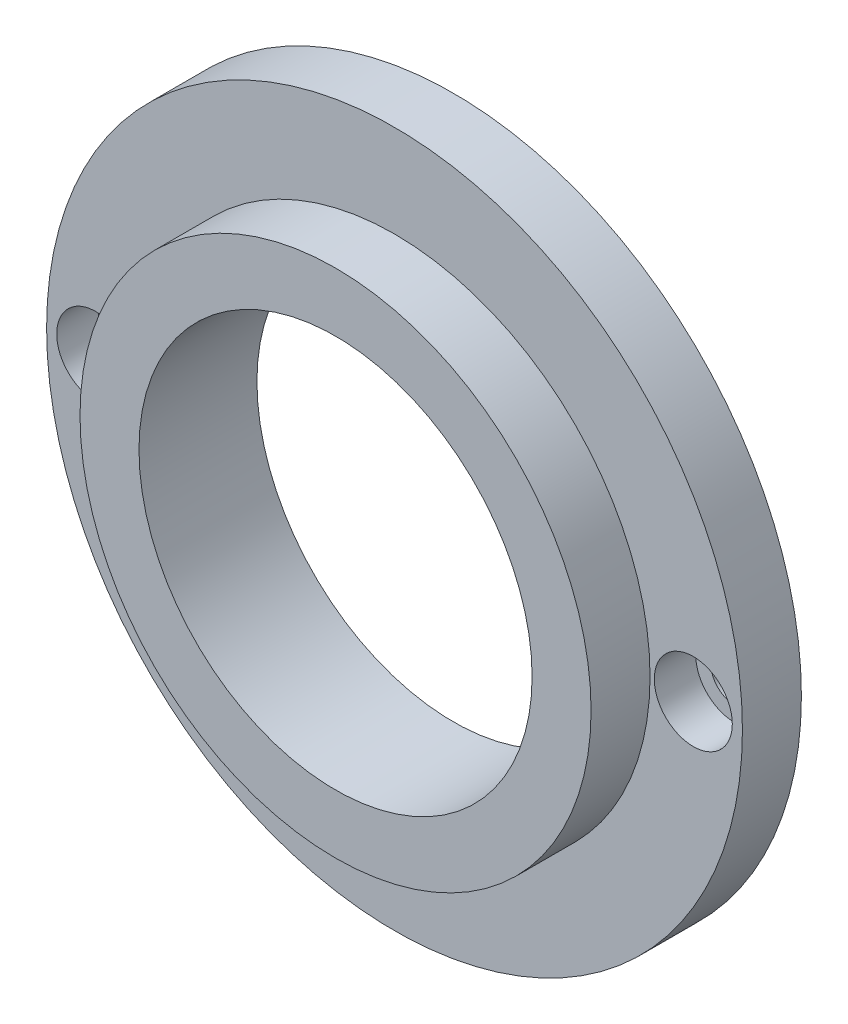
ISO-10303-21;
HEADER;
FILE_DESCRIPTION(('STEP AP214'),'2;1');
FILE_NAME('part.step','',(''),(''),'','','');
FILE_SCHEMA(('AUTOMOTIVE_DESIGN { 1 0 10303 214 1 1 1 1 }'));
ENDSEC;
DATA;
#1=APPLICATION_CONTEXT('core data for automotive mechanical design processes');
#2=APPLICATION_PROTOCOL_DEFINITION('international standard','automotive_design',2000,#1);
#3=PRODUCT_CONTEXT('',#1,'mechanical');
#4=PRODUCT('Part','Part','',(#3));
#5=PRODUCT_RELATED_PRODUCT_CATEGORY('part','',(#4));
#6=PRODUCT_DEFINITION_FORMATION('','',#4);
#7=PRODUCT_DEFINITION_CONTEXT('part definition',#1,'design');
#8=PRODUCT_DEFINITION('design','',#6,#7);
#9=PRODUCT_DEFINITION_SHAPE('','',#8);
#10=(LENGTH_UNIT() NAMED_UNIT(*) SI_UNIT(.MILLI.,.METRE.));
#11=(NAMED_UNIT(*) PLANE_ANGLE_UNIT() SI_UNIT($,.RADIAN.));
#12=(NAMED_UNIT(*) SI_UNIT($,.STERADIAN.) SOLID_ANGLE_UNIT());
#13=UNCERTAINTY_MEASURE_WITH_UNIT(LENGTH_MEASURE(1.E-05),#10,'distance_accuracy_value','');
#14=(GEOMETRIC_REPRESENTATION_CONTEXT(3) GLOBAL_UNCERTAINTY_ASSIGNED_CONTEXT((#13)) GLOBAL_UNIT_ASSIGNED_CONTEXT((#10,
#11,#12)) REPRESENTATION_CONTEXT('',''));
#15=CARTESIAN_POINT('',(0.,0.,0.));
#16=DIRECTION('',(0.,0.,1.));
#17=DIRECTION('',(1.,0.,0.));
#18=AXIS2_PLACEMENT_3D('',#15,#16,#17);
#19=CARTESIAN_POINT('',(0.,0.,3.));
#20=DIRECTION('',(0.,0.,1.));
#21=DIRECTION('',(1.,0.,0.));
#22=AXIS2_PLACEMENT_3D('',#19,#20,#21);
#23=PLANE('',#22);
#24=CARTESIAN_POINT('',(0.,0.,3.));
#25=DIRECTION('',(0.,0.,1.));
#26=DIRECTION('',(1.,0.,0.));
#27=AXIS2_PLACEMENT_3D('',#24,#25,#26);
#28=CIRCLE('',#27,13.);
#29=CARTESIAN_POINT('',(13.,0.,3.));
#30=VERTEX_POINT('',#29);
#31=EDGE_CURVE('E10',#30,#30,#28,.T.);
#32=ORIENTED_EDGE('',*,*,#31,.T.);
#33=EDGE_LOOP('',(#32));
#34=FACE_BOUND('',#33,.T.);
#35=CARTESIAN_POINT('',(0.,0.,3.));
#36=DIRECTION('',(0.,0.,1.));
#37=DIRECTION('',(1.,0.,0.));
#38=AXIS2_PLACEMENT_3D('',#35,#36,#37);
#39=CIRCLE('',#38,10.);
#40=CARTESIAN_POINT('',(10.,0.,3.));
#41=VERTEX_POINT('',#40);
#42=EDGE_CURVE('E44',#41,#41,#39,.T.);
#43=ORIENTED_EDGE('',*,*,#42,.F.);
#44=EDGE_LOOP('',(#43));
#45=FACE_BOUND('',#44,.T.);
#46=ADVANCED_FACE('F36',(#34,#45),#23,.T.);
#47=CARTESIAN_POINT('',(0.,0.,3.));
#48=DIRECTION('',(0.,0.,-1.));
#49=DIRECTION('',(-1.,0.,0.));
#50=AXIS2_PLACEMENT_3D('',#47,#48,#49);
#51=CYLINDRICAL_SURFACE('',#50,13.);
#52=ORIENTED_EDGE('',*,*,#31,.F.);
#53=EDGE_LOOP('',(#52));
#54=FACE_BOUND('',#53,.T.);
#55=CARTESIAN_POINT('',(0.,0.,0.));
#56=DIRECTION('',(0.,0.,1.));
#57=DIRECTION('',(1.,0.,0.));
#58=AXIS2_PLACEMENT_3D('',#55,#56,#57);
#59=CIRCLE('',#58,13.);
#60=CARTESIAN_POINT('',(13.,0.,0.));
#61=VERTEX_POINT('',#60);
#62=EDGE_CURVE('E40',#61,#61,#59,.T.);
#63=ORIENTED_EDGE('',*,*,#62,.T.);
#64=EDGE_LOOP('',(#63));
#65=FACE_BOUND('',#64,.T.);
#66=ADVANCED_FACE('F38',(#54,#65),#51,.T.);
#67=CARTESIAN_POINT('',(0.,0.,3.));
#68=DIRECTION('',(0.,0.,-1.));
#69=DIRECTION('',(-1.,0.,0.));
#70=AXIS2_PLACEMENT_3D('',#67,#68,#69);
#71=CYLINDRICAL_SURFACE('',#70,10.);
#72=ORIENTED_EDGE('',*,*,#42,.T.);
#73=EDGE_LOOP('',(#72));
#74=FACE_BOUND('',#73,.T.);
#75=CARTESIAN_POINT('',(0.,0.,-3.));
#76=DIRECTION('',(0.,0.,-1.));
#77=DIRECTION('',(-1.,0.,0.));
#78=AXIS2_PLACEMENT_3D('',#75,#76,#77);
#79=CIRCLE('',#78,10.);
#80=CARTESIAN_POINT('',(-10.,0.,-3.));
#81=VERTEX_POINT('',#80);
#82=EDGE_CURVE('E54',#81,#81,#79,.T.);
#83=ORIENTED_EDGE('',*,*,#82,.T.);
#84=EDGE_LOOP('',(#83));
#85=FACE_BOUND('',#84,.T.);
#86=ADVANCED_FACE('F115',(#74,#85),#71,.F.);
#87=CARTESIAN_POINT('',(0.,0.,-3.));
#88=DIRECTION('',(0.,0.,-1.));
#89=DIRECTION('',(-1.,0.,0.));
#90=AXIS2_PLACEMENT_3D('',#87,#88,#89);
#91=PLANE('',#90);
#92=CARTESIAN_POINT('',(-15.2,0.,-3.));
#93=DIRECTION('',(0.,0.,1.));
#94=DIRECTION('',(1.,0.,0.));
#95=AXIS2_PLACEMENT_3D('',#92,#93,#94);
#96=CIRCLE('',#95,1.2192);
#97=CARTESIAN_POINT('',(-13.9808,0.,-3.));
#98=VERTEX_POINT('',#97);
#99=EDGE_CURVE('E71',#98,#98,#96,.T.);
#100=ORIENTED_EDGE('',*,*,#99,.T.);
#101=EDGE_LOOP('',(#100));
#102=FACE_BOUND('',#101,.T.);
#103=CARTESIAN_POINT('',(15.2,0.,-3.));
#104=DIRECTION('',(0.,0.,1.));
#105=DIRECTION('',(1.,0.,0.));
#106=AXIS2_PLACEMENT_3D('',#103,#104,#105);
#107=CIRCLE('',#106,1.2192);
#108=CARTESIAN_POINT('',(16.4192,0.,-3.));
#109=VERTEX_POINT('',#108);
#110=EDGE_CURVE('E59',#109,#109,#107,.T.);
#111=ORIENTED_EDGE('',*,*,#110,.T.);
#112=EDGE_LOOP('',(#111));
#113=FACE_BOUND('',#112,.T.);
#114=CARTESIAN_POINT('',(0.,0.,-3.));
#115=DIRECTION('',(0.,0.,-1.));
#116=DIRECTION('',(-1.,0.,0.));
#117=AXIS2_PLACEMENT_3D('',#114,#115,#116);
#118=CIRCLE('',#117,17.7);
#119=CARTESIAN_POINT('',(-17.7,0.,-3.));
#120=VERTEX_POINT('',#119);
#121=EDGE_CURVE('E53',#120,#120,#118,.T.);
#122=ORIENTED_EDGE('',*,*,#121,.T.);
#123=EDGE_LOOP('',(#122));
#124=FACE_BOUND('',#123,.T.);
#125=ORIENTED_EDGE('',*,*,#82,.F.);
#126=EDGE_LOOP('',(#125));
#127=FACE_BOUND('',#126,.T.);
#128=ADVANCED_FACE('F90',(#102,#113,#124,#127),#91,.T.);
#129=CARTESIAN_POINT('',(0.,0.,0.));
#130=DIRECTION('',(0.,0.,-1.));
#131=DIRECTION('',(-1.,0.,0.));
#132=AXIS2_PLACEMENT_3D('',#129,#130,#131);
#133=PLANE('',#132);
#134=CARTESIAN_POINT('',(-15.2,0.,0.));
#135=DIRECTION('',(0.,0.,1.));
#136=DIRECTION('',(1.,0.,0.));
#137=AXIS2_PLACEMENT_3D('',#134,#135,#136);
#138=CIRCLE('',#137,1.98501);
#139=CARTESIAN_POINT('',(-13.21499,0.,0.));
#140=VERTEX_POINT('',#139);
#141=EDGE_CURVE('E80',#140,#140,#138,.T.);
#142=ORIENTED_EDGE('',*,*,#141,.F.);
#143=EDGE_LOOP('',(#142));
#144=FACE_BOUND('',#143,.T.);
#145=CARTESIAN_POINT('',(15.2,0.,0.));
#146=DIRECTION('',(0.,0.,1.));
#147=DIRECTION('',(1.,0.,0.));
#148=AXIS2_PLACEMENT_3D('',#145,#146,#147);
#149=CIRCLE('',#148,1.98501);
#150=CARTESIAN_POINT('',(17.18501,0.,0.));
#151=VERTEX_POINT('',#150);
#152=EDGE_CURVE('E68',#151,#151,#149,.T.);
#153=ORIENTED_EDGE('',*,*,#152,.F.);
#154=EDGE_LOOP('',(#153));
#155=FACE_BOUND('',#154,.T.);
#156=ORIENTED_EDGE('',*,*,#62,.F.);
#157=EDGE_LOOP('',(#156));
#158=FACE_BOUND('',#157,.T.);
#159=CARTESIAN_POINT('',(0.,0.,0.));
#160=DIRECTION('',(0.,0.,-1.));
#161=DIRECTION('',(-1.,0.,0.));
#162=AXIS2_PLACEMENT_3D('',#159,#160,#161);
#163=CIRCLE('',#162,17.7);
#164=CARTESIAN_POINT('',(-17.7,0.,0.));
#165=VERTEX_POINT('',#164);
#166=EDGE_CURVE('E50',#165,#165,#163,.T.);
#167=ORIENTED_EDGE('',*,*,#166,.F.);
#168=EDGE_LOOP('',(#167));
#169=FACE_BOUND('',#168,.T.);
#170=ADVANCED_FACE('F86',(#144,#155,#158,#169),#133,.F.);
#171=CARTESIAN_POINT('',(0.,0.,-3.));
#172=DIRECTION('',(0.,0.,1.));
#173=DIRECTION('',(1.,0.,0.));
#174=AXIS2_PLACEMENT_3D('',#171,#172,#173);
#175=CYLINDRICAL_SURFACE('',#174,17.7);
#176=ORIENTED_EDGE('',*,*,#121,.F.);
#177=EDGE_LOOP('',(#176));
#178=FACE_BOUND('',#177,.T.);
#179=ORIENTED_EDGE('',*,*,#166,.T.);
#180=EDGE_LOOP('',(#179));
#181=FACE_BOUND('',#180,.T.);
#182=ADVANCED_FACE('F89',(#178,#181),#175,.T.);
#183=CARTESIAN_POINT('',(15.2,0.,0.));
#184=DIRECTION('',(0.,0.,1.));
#185=DIRECTION('',(1.,0.,0.));
#186=AXIS2_PLACEMENT_3D('',#183,#184,#185);
#187=CYLINDRICAL_SURFACE('',#186,1.2192);
#188=ORIENTED_EDGE('',*,*,#110,.F.);
#189=EDGE_LOOP('',(#188));
#190=FACE_BOUND('',#189,.T.);
#191=CARTESIAN_POINT('',(15.2,0.,-2.1082));
#192=DIRECTION('',(0.,0.,1.));
#193=DIRECTION('',(1.,0.,0.));
#194=AXIS2_PLACEMENT_3D('',#191,#192,#193);
#195=CIRCLE('',#194,1.2192);
#196=CARTESIAN_POINT('',(16.4192,0.,-2.1082));
#197=VERTEX_POINT('',#196);
#198=EDGE_CURVE('E62',#197,#197,#195,.T.);
#199=ORIENTED_EDGE('',*,*,#198,.T.);
#200=EDGE_LOOP('',(#199));
#201=FACE_BOUND('',#200,.T.);
#202=ADVANCED_FACE('F100',(#190,#201),#187,.F.);
#203=CARTESIAN_POINT('',(16.4192,0.,-2.1082));
#204=DIRECTION('',(0.,0.,-1.));
#205=DIRECTION('',(-1.,0.,0.));
#206=AXIS2_PLACEMENT_3D('',#203,#204,#205);
#207=PLANE('',#206);
#208=ORIENTED_EDGE('',*,*,#198,.F.);
#209=EDGE_LOOP('',(#208));
#210=FACE_BOUND('',#209,.T.);
#211=CARTESIAN_POINT('',(15.2,0.,-2.1082));
#212=DIRECTION('',(0.,0.,1.));
#213=DIRECTION('',(1.,0.,0.));
#214=AXIS2_PLACEMENT_3D('',#211,#212,#213);
#215=CIRCLE('',#214,1.98501);
#216=CARTESIAN_POINT('',(17.18501,0.,-2.1082));
#217=VERTEX_POINT('',#216);
#218=EDGE_CURVE('E65',#217,#217,#215,.T.);
#219=ORIENTED_EDGE('',*,*,#218,.T.);
#220=EDGE_LOOP('',(#219));
#221=FACE_BOUND('',#220,.T.);
#222=ADVANCED_FACE('F106',(#210,#221),#207,.F.);
#223=CARTESIAN_POINT('',(15.2,0.,0.));
#224=DIRECTION('',(0.,0.,1.));
#225=DIRECTION('',(1.,0.,0.));
#226=AXIS2_PLACEMENT_3D('',#223,#224,#225);
#227=CYLINDRICAL_SURFACE('',#226,1.98501);
#228=ORIENTED_EDGE('',*,*,#218,.F.);
#229=EDGE_LOOP('',(#228));
#230=FACE_BOUND('',#229,.T.);
#231=ORIENTED_EDGE('',*,*,#152,.T.);
#232=EDGE_LOOP('',(#231));
#233=FACE_BOUND('',#232,.T.);
#234=ADVANCED_FACE('F135',(#230,#233),#227,.F.);
#235=CARTESIAN_POINT('',(-15.2,0.,0.));
#236=DIRECTION('',(0.,0.,1.));
#237=DIRECTION('',(1.,0.,0.));
#238=AXIS2_PLACEMENT_3D('',#235,#236,#237);
#239=CYLINDRICAL_SURFACE('',#238,1.2192);
#240=ORIENTED_EDGE('',*,*,#99,.F.);
#241=EDGE_LOOP('',(#240));
#242=FACE_BOUND('',#241,.T.);
#243=CARTESIAN_POINT('',(-15.2,0.,-2.1082));
#244=DIRECTION('',(0.,0.,1.));
#245=DIRECTION('',(1.,0.,0.));
#246=AXIS2_PLACEMENT_3D('',#243,#244,#245);
#247=CIRCLE('',#246,1.2192);
#248=CARTESIAN_POINT('',(-13.9808,0.,-2.1082));
#249=VERTEX_POINT('',#248);
#250=EDGE_CURVE('E74',#249,#249,#247,.T.);
#251=ORIENTED_EDGE('',*,*,#250,.T.);
#252=EDGE_LOOP('',(#251));
#253=FACE_BOUND('',#252,.T.);
#254=ADVANCED_FACE('F139',(#242,#253),#239,.F.);
#255=CARTESIAN_POINT('',(-13.9808,0.,-2.1082));
#256=DIRECTION('',(0.,0.,-1.));
#257=DIRECTION('',(-1.,0.,0.));
#258=AXIS2_PLACEMENT_3D('',#255,#256,#257);
#259=PLANE('',#258);
#260=ORIENTED_EDGE('',*,*,#250,.F.);
#261=EDGE_LOOP('',(#260));
#262=FACE_BOUND('',#261,.T.);
#263=CARTESIAN_POINT('',(-15.2,0.,-2.1082));
#264=DIRECTION('',(0.,0.,1.));
#265=DIRECTION('',(1.,0.,0.));
#266=AXIS2_PLACEMENT_3D('',#263,#264,#265);
#267=CIRCLE('',#266,1.98501);
#268=CARTESIAN_POINT('',(-13.21499,0.,-2.1082));
#269=VERTEX_POINT('',#268);
#270=EDGE_CURVE('E77',#269,#269,#267,.T.);
#271=ORIENTED_EDGE('',*,*,#270,.T.);
#272=EDGE_LOOP('',(#271));
#273=FACE_BOUND('',#272,.T.);
#274=ADVANCED_FACE('F143',(#262,#273),#259,.F.);
#275=CARTESIAN_POINT('',(-15.2,0.,0.));
#276=DIRECTION('',(0.,0.,1.));
#277=DIRECTION('',(1.,0.,0.));
#278=AXIS2_PLACEMENT_3D('',#275,#276,#277);
#279=CYLINDRICAL_SURFACE('',#278,1.98501);
#280=ORIENTED_EDGE('',*,*,#270,.F.);
#281=EDGE_LOOP('',(#280));
#282=FACE_BOUND('',#281,.T.);
#283=ORIENTED_EDGE('',*,*,#141,.T.);
#284=EDGE_LOOP('',(#283));
#285=FACE_BOUND('',#284,.T.);
#286=ADVANCED_FACE('F84',(#282,#285),#279,.F.);
#287=CLOSED_SHELL('',(#46,#66,#86,#128,#170,#182,#202,#222,#234,#254,#274,#286));
#288=MANIFOLD_SOLID_BREP('B2',#287);
#289=ADVANCED_BREP_SHAPE_REPRESENTATION('',(#18,#288),#14);
#290=SHAPE_DEFINITION_REPRESENTATION(#9,#289);
ENDSEC;
END-ISO-10303-21;
